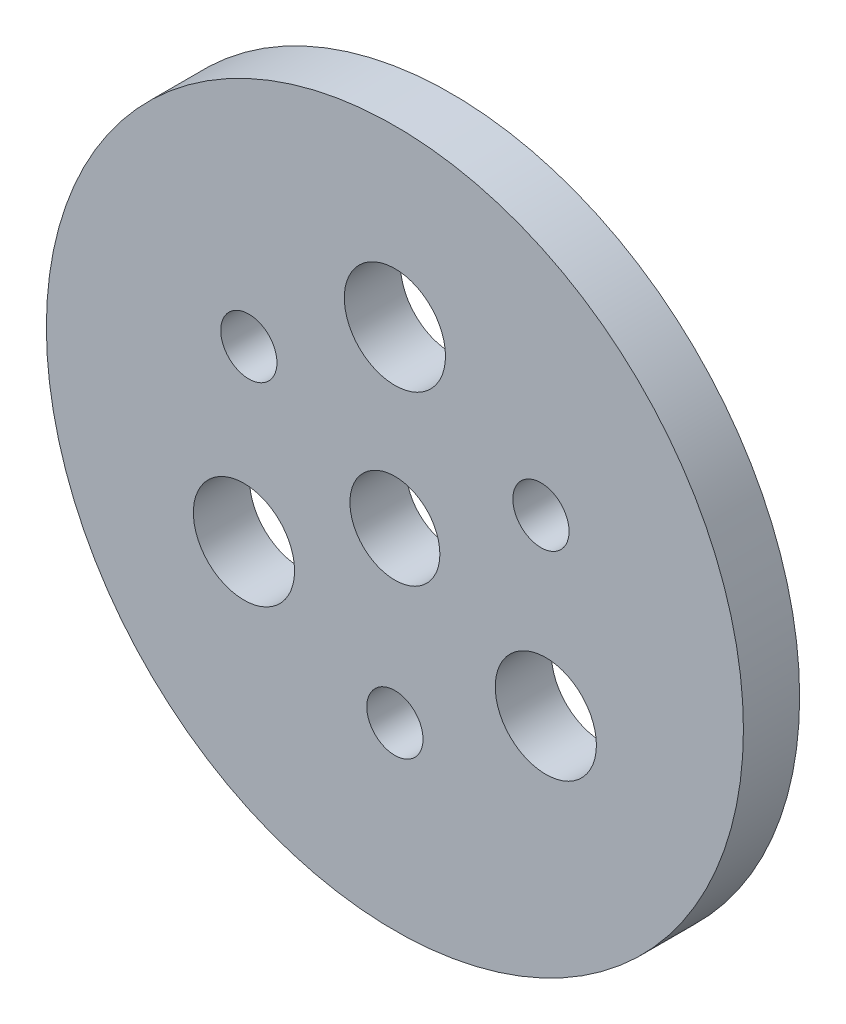
ISO-10303-21;
HEADER;
FILE_DESCRIPTION(('STEP AP214'),'2;1');
FILE_NAME('part.step','',(''),(''),'','','');
FILE_SCHEMA(('AUTOMOTIVE_DESIGN { 1 0 10303 214 1 1 1 1 }'));
ENDSEC;
DATA;
#1=APPLICATION_CONTEXT('core data for automotive mechanical design processes');
#2=APPLICATION_PROTOCOL_DEFINITION('international standard','automotive_design',2000,#1);
#3=PRODUCT_CONTEXT('',#1,'mechanical');
#4=PRODUCT('Part','Part','',(#3));
#5=PRODUCT_RELATED_PRODUCT_CATEGORY('part','',(#4));
#6=PRODUCT_DEFINITION_FORMATION('','',#4);
#7=PRODUCT_DEFINITION_CONTEXT('part definition',#1,'design');
#8=PRODUCT_DEFINITION('design','',#6,#7);
#9=PRODUCT_DEFINITION_SHAPE('','',#8);
#10=(LENGTH_UNIT() NAMED_UNIT(*) SI_UNIT(.MILLI.,.METRE.));
#11=(NAMED_UNIT(*) PLANE_ANGLE_UNIT() SI_UNIT($,.RADIAN.));
#12=(NAMED_UNIT(*) SI_UNIT($,.STERADIAN.) SOLID_ANGLE_UNIT());
#13=UNCERTAINTY_MEASURE_WITH_UNIT(LENGTH_MEASURE(1.E-05),#10,'distance_accuracy_value','');
#14=(GEOMETRIC_REPRESENTATION_CONTEXT(3) GLOBAL_UNCERTAINTY_ASSIGNED_CONTEXT((#13)) GLOBAL_UNIT_ASSIGNED_CONTEXT((#10,
#11,#12)) REPRESENTATION_CONTEXT('',''));
#15=CARTESIAN_POINT('',(0.,0.,0.));
#16=DIRECTION('',(0.,0.,1.));
#17=DIRECTION('',(1.,0.,0.));
#18=AXIS2_PLACEMENT_3D('',#15,#16,#17);
#19=CARTESIAN_POINT('',(0.,0.,5.));
#20=DIRECTION('',(0.,0.,1.));
#21=DIRECTION('',(1.,0.,0.));
#22=AXIS2_PLACEMENT_3D('',#19,#20,#21);
#23=PLANE('',#22);
#24=CARTESIAN_POINT('',(13.4233937586598,-7.74999999999943,5.));
#25=DIRECTION('',(0.,0.,1.));
#26=DIRECTION('',(1.,0.,0.));
#27=AXIS2_PLACEMENT_3D('',#24,#25,#26);
#28=CIRCLE('',#27,4.5);
#29=CARTESIAN_POINT('',(17.9233937586598,-7.74999999999943,5.));
#30=VERTEX_POINT('',#29);
#31=EDGE_CURVE('E71',#30,#30,#28,.T.);
#32=ORIENTED_EDGE('',*,*,#31,.F.);
#33=EDGE_LOOP('',(#32));
#34=FACE_BOUND('',#33,.T.);
#35=CARTESIAN_POINT('',(0.,15.5,5.));
#36=DIRECTION('',(0.,0.,1.));
#37=DIRECTION('',(1.,0.,0.));
#38=AXIS2_PLACEMENT_3D('',#35,#36,#37);
#39=CIRCLE('',#38,4.5);
#40=CARTESIAN_POINT('',(4.5,15.5,5.));
#41=VERTEX_POINT('',#40);
#42=EDGE_CURVE('E59',#41,#41,#39,.T.);
#43=ORIENTED_EDGE('',*,*,#42,.F.);
#44=EDGE_LOOP('',(#43));
#45=FACE_BOUND('',#44,.T.);
#46=CARTESIAN_POINT('',(0.,-15.,5.));
#47=DIRECTION('',(0.,0.,1.));
#48=DIRECTION('',(1.,0.,0.));
#49=AXIS2_PLACEMENT_3D('',#46,#47,#48);
#50=CIRCLE('',#49,2.5);
#51=CARTESIAN_POINT('',(2.5,-15.,5.));
#52=VERTEX_POINT('',#51);
#53=EDGE_CURVE('E47',#52,#52,#50,.T.);
#54=ORIENTED_EDGE('',*,*,#53,.F.);
#55=EDGE_LOOP('',(#54));
#56=FACE_BOUND('',#55,.T.);
#57=CARTESIAN_POINT('',(0.,0.,5.));
#58=DIRECTION('',(0.,0.,1.));
#59=DIRECTION('',(1.,0.,0.));
#60=AXIS2_PLACEMENT_3D('',#57,#58,#59);
#61=CIRCLE('',#60,31.);
#62=CARTESIAN_POINT('',(31.,0.,5.));
#63=VERTEX_POINT('',#62);
#64=EDGE_CURVE('E10',#63,#63,#61,.T.);
#65=ORIENTED_EDGE('',*,*,#64,.T.);
#66=EDGE_LOOP('',(#65));
#67=FACE_BOUND('',#66,.T.);
#68=CARTESIAN_POINT('',(0.,0.,5.));
#69=DIRECTION('',(0.,0.,1.));
#70=DIRECTION('',(1.,0.,0.));
#71=AXIS2_PLACEMENT_3D('',#68,#69,#70);
#72=CIRCLE('',#71,4.);
#73=CARTESIAN_POINT('',(4.,0.,5.));
#74=VERTEX_POINT('',#73);
#75=EDGE_CURVE('E42',#74,#74,#72,.T.);
#76=ORIENTED_EDGE('',*,*,#75,.F.);
#77=EDGE_LOOP('',(#76));
#78=FACE_BOUND('',#77,.T.);
#79=CARTESIAN_POINT('',(-12.9903810567666,7.50000000000006,5.));
#80=DIRECTION('',(0.,0.,1.));
#81=DIRECTION('',(1.,0.,0.));
#82=AXIS2_PLACEMENT_3D('',#79,#80,#81);
#83=CIRCLE('',#82,2.5);
#84=CARTESIAN_POINT('',(-10.4903810567666,7.50000000000006,5.));
#85=VERTEX_POINT('',#84);
#86=EDGE_CURVE('E53',#85,#85,#83,.T.);
#87=ORIENTED_EDGE('',*,*,#86,.F.);
#88=EDGE_LOOP('',(#87));
#89=FACE_BOUND('',#88,.T.);
#90=CARTESIAN_POINT('',(12.9903810567667,7.49999999999988,5.));
#91=DIRECTION('',(0.,0.,1.));
#92=DIRECTION('',(1.,0.,0.));
#93=AXIS2_PLACEMENT_3D('',#90,#91,#92);
#94=CIRCLE('',#93,2.5);
#95=CARTESIAN_POINT('',(15.4903810567667,7.49999999999988,5.));
#96=VERTEX_POINT('',#95);
#97=EDGE_CURVE('E65',#96,#96,#94,.T.);
#98=ORIENTED_EDGE('',*,*,#97,.F.);
#99=EDGE_LOOP('',(#98));
#100=FACE_BOUND('',#99,.T.);
#101=CARTESIAN_POINT('',(-13.4233937586578,-7.75000000000058,5.));
#102=DIRECTION('',(0.,0.,1.));
#103=DIRECTION('',(1.,0.,0.));
#104=AXIS2_PLACEMENT_3D('',#101,#102,#103);
#105=CIRCLE('',#104,4.5);
#106=CARTESIAN_POINT('',(-8.92339375865781,-7.75000000000058,5.));
#107=VERTEX_POINT('',#106);
#108=EDGE_CURVE('E77',#107,#107,#105,.T.);
#109=ORIENTED_EDGE('',*,*,#108,.F.);
#110=EDGE_LOOP('',(#109));
#111=FACE_BOUND('',#110,.T.);
#112=ADVANCED_FACE('F31',(#34,#45,#56,#67,#78,#89,#100,#111),#23,.T.);
#113=CARTESIAN_POINT('',(0.,0.,0.));
#114=DIRECTION('',(0.,0.,1.));
#115=DIRECTION('',(1.,0.,0.));
#116=AXIS2_PLACEMENT_3D('',#113,#114,#115);
#117=PLANE('',#116);
#118=CARTESIAN_POINT('',(0.,0.,0.));
#119=DIRECTION('',(0.,0.,1.));
#120=DIRECTION('',(1.,0.,0.));
#121=AXIS2_PLACEMENT_3D('',#118,#119,#120);
#122=CIRCLE('',#121,31.);
#123=CARTESIAN_POINT('',(31.,0.,0.));
#124=VERTEX_POINT('',#123);
#125=EDGE_CURVE('E35',#124,#124,#122,.T.);
#126=ORIENTED_EDGE('',*,*,#125,.F.);
#127=EDGE_LOOP('',(#126));
#128=FACE_BOUND('',#127,.T.);
#129=CARTESIAN_POINT('',(0.,0.,0.));
#130=DIRECTION('',(0.,0.,1.));
#131=DIRECTION('',(1.,0.,0.));
#132=AXIS2_PLACEMENT_3D('',#129,#130,#131);
#133=CIRCLE('',#132,4.);
#134=CARTESIAN_POINT('',(4.,0.,0.));
#135=VERTEX_POINT('',#134);
#136=EDGE_CURVE('E44',#135,#135,#133,.T.);
#137=ORIENTED_EDGE('',*,*,#136,.T.);
#138=EDGE_LOOP('',(#137));
#139=FACE_BOUND('',#138,.T.);
#140=CARTESIAN_POINT('',(0.,-15.,0.));
#141=DIRECTION('',(0.,0.,1.));
#142=DIRECTION('',(1.,0.,0.));
#143=AXIS2_PLACEMENT_3D('',#140,#141,#142);
#144=CIRCLE('',#143,2.5);
#145=CARTESIAN_POINT('',(2.5,-15.,0.));
#146=VERTEX_POINT('',#145);
#147=EDGE_CURVE('E50',#146,#146,#144,.T.);
#148=ORIENTED_EDGE('',*,*,#147,.T.);
#149=EDGE_LOOP('',(#148));
#150=FACE_BOUND('',#149,.T.);
#151=CARTESIAN_POINT('',(-12.9903810567666,7.50000000000006,0.));
#152=DIRECTION('',(0.,0.,1.));
#153=DIRECTION('',(1.,0.,0.));
#154=AXIS2_PLACEMENT_3D('',#151,#152,#153);
#155=CIRCLE('',#154,2.5);
#156=CARTESIAN_POINT('',(-10.4903810567666,7.50000000000006,0.));
#157=VERTEX_POINT('',#156);
#158=EDGE_CURVE('E56',#157,#157,#155,.T.);
#159=ORIENTED_EDGE('',*,*,#158,.T.);
#160=EDGE_LOOP('',(#159));
#161=FACE_BOUND('',#160,.T.);
#162=CARTESIAN_POINT('',(0.,15.5,0.));
#163=DIRECTION('',(0.,0.,1.));
#164=DIRECTION('',(1.,0.,0.));
#165=AXIS2_PLACEMENT_3D('',#162,#163,#164);
#166=CIRCLE('',#165,4.5);
#167=CARTESIAN_POINT('',(4.5,15.5,0.));
#168=VERTEX_POINT('',#167);
#169=EDGE_CURVE('E62',#168,#168,#166,.T.);
#170=ORIENTED_EDGE('',*,*,#169,.T.);
#171=EDGE_LOOP('',(#170));
#172=FACE_BOUND('',#171,.T.);
#173=CARTESIAN_POINT('',(12.9903810567667,7.49999999999988,0.));
#174=DIRECTION('',(0.,0.,1.));
#175=DIRECTION('',(1.,0.,0.));
#176=AXIS2_PLACEMENT_3D('',#173,#174,#175);
#177=CIRCLE('',#176,2.5);
#178=CARTESIAN_POINT('',(15.4903810567667,7.49999999999988,0.));
#179=VERTEX_POINT('',#178);
#180=EDGE_CURVE('E68',#179,#179,#177,.T.);
#181=ORIENTED_EDGE('',*,*,#180,.T.);
#182=EDGE_LOOP('',(#181));
#183=FACE_BOUND('',#182,.T.);
#184=CARTESIAN_POINT('',(13.4233937586598,-7.74999999999943,0.));
#185=DIRECTION('',(0.,0.,1.));
#186=DIRECTION('',(1.,0.,0.));
#187=AXIS2_PLACEMENT_3D('',#184,#185,#186);
#188=CIRCLE('',#187,4.5);
#189=CARTESIAN_POINT('',(17.9233937586598,-7.74999999999943,0.));
#190=VERTEX_POINT('',#189);
#191=EDGE_CURVE('E74',#190,#190,#188,.T.);
#192=ORIENTED_EDGE('',*,*,#191,.T.);
#193=EDGE_LOOP('',(#192));
#194=FACE_BOUND('',#193,.T.);
#195=CARTESIAN_POINT('',(-13.4233937586578,-7.75000000000058,0.));
#196=DIRECTION('',(0.,0.,1.));
#197=DIRECTION('',(1.,0.,0.));
#198=AXIS2_PLACEMENT_3D('',#195,#196,#197);
#199=CIRCLE('',#198,4.5);
#200=CARTESIAN_POINT('',(-8.92339375865781,-7.75000000000058,0.));
#201=VERTEX_POINT('',#200);
#202=EDGE_CURVE('E80',#201,#201,#199,.T.);
#203=ORIENTED_EDGE('',*,*,#202,.T.);
#204=EDGE_LOOP('',(#203));
#205=FACE_BOUND('',#204,.T.);
#206=ADVANCED_FACE('F90',(#128,#139,#150,#161,#172,#183,#194,#205),#117,.F.);
#207=CARTESIAN_POINT('',(0.,0.,5.));
#208=DIRECTION('',(0.,0.,-1.));
#209=DIRECTION('',(-1.,0.,0.));
#210=AXIS2_PLACEMENT_3D('',#207,#208,#209);
#211=CYLINDRICAL_SURFACE('',#210,31.);
#212=ORIENTED_EDGE('',*,*,#64,.F.);
#213=EDGE_LOOP('',(#212));
#214=FACE_BOUND('',#213,.T.);
#215=ORIENTED_EDGE('',*,*,#125,.T.);
#216=EDGE_LOOP('',(#215));
#217=FACE_BOUND('',#216,.T.);
#218=ADVANCED_FACE('F33',(#214,#217),#211,.T.);
#219=CARTESIAN_POINT('',(0.,0.,5.));
#220=DIRECTION('',(0.,0.,-1.));
#221=DIRECTION('',(-1.,0.,0.));
#222=AXIS2_PLACEMENT_3D('',#219,#220,#221);
#223=CYLINDRICAL_SURFACE('',#222,4.);
#224=ORIENTED_EDGE('',*,*,#75,.T.);
#225=EDGE_LOOP('',(#224));
#226=FACE_BOUND('',#225,.T.);
#227=ORIENTED_EDGE('',*,*,#136,.F.);
#228=EDGE_LOOP('',(#227));
#229=FACE_BOUND('',#228,.T.);
#230=ADVANCED_FACE('F100',(#226,#229),#223,.F.);
#231=CARTESIAN_POINT('',(0.,-15.,5.));
#232=DIRECTION('',(0.,0.,-1.));
#233=DIRECTION('',(-1.,0.,0.));
#234=AXIS2_PLACEMENT_3D('',#231,#232,#233);
#235=CYLINDRICAL_SURFACE('',#234,2.5);
#236=ORIENTED_EDGE('',*,*,#53,.T.);
#237=EDGE_LOOP('',(#236));
#238=FACE_BOUND('',#237,.T.);
#239=ORIENTED_EDGE('',*,*,#147,.F.);
#240=EDGE_LOOP('',(#239));
#241=FACE_BOUND('',#240,.T.);
#242=ADVANCED_FACE('F103',(#238,#241),#235,.F.);
#243=CARTESIAN_POINT('',(-12.9903810567666,7.50000000000006,5.));
#244=DIRECTION('',(0.,0.,-1.));
#245=DIRECTION('',(-1.,0.,0.));
#246=AXIS2_PLACEMENT_3D('',#243,#244,#245);
#247=CYLINDRICAL_SURFACE('',#246,2.5);
#248=ORIENTED_EDGE('',*,*,#86,.T.);
#249=EDGE_LOOP('',(#248));
#250=FACE_BOUND('',#249,.T.);
#251=ORIENTED_EDGE('',*,*,#158,.F.);
#252=EDGE_LOOP('',(#251));
#253=FACE_BOUND('',#252,.T.);
#254=ADVANCED_FACE('F107',(#250,#253),#247,.F.);
#255=CARTESIAN_POINT('',(0.,15.5,5.));
#256=DIRECTION('',(0.,0.,-1.));
#257=DIRECTION('',(-1.,0.,0.));
#258=AXIS2_PLACEMENT_3D('',#255,#256,#257);
#259=CYLINDRICAL_SURFACE('',#258,4.5);
#260=ORIENTED_EDGE('',*,*,#42,.T.);
#261=EDGE_LOOP('',(#260));
#262=FACE_BOUND('',#261,.T.);
#263=ORIENTED_EDGE('',*,*,#169,.F.);
#264=EDGE_LOOP('',(#263));
#265=FACE_BOUND('',#264,.T.);
#266=ADVANCED_FACE('F111',(#262,#265),#259,.F.);
#267=CARTESIAN_POINT('',(12.9903810567667,7.49999999999988,5.));
#268=DIRECTION('',(0.,0.,-1.));
#269=DIRECTION('',(-1.,0.,0.));
#270=AXIS2_PLACEMENT_3D('',#267,#268,#269);
#271=CYLINDRICAL_SURFACE('',#270,2.5);
#272=ORIENTED_EDGE('',*,*,#97,.T.);
#273=EDGE_LOOP('',(#272));
#274=FACE_BOUND('',#273,.T.);
#275=ORIENTED_EDGE('',*,*,#180,.F.);
#276=EDGE_LOOP('',(#275));
#277=FACE_BOUND('',#276,.T.);
#278=ADVANCED_FACE('F115',(#274,#277),#271,.F.);
#279=CARTESIAN_POINT('',(13.4233937586598,-7.74999999999943,5.));
#280=DIRECTION('',(0.,0.,-1.));
#281=DIRECTION('',(-1.,0.,0.));
#282=AXIS2_PLACEMENT_3D('',#279,#280,#281);
#283=CYLINDRICAL_SURFACE('',#282,4.5);
#284=ORIENTED_EDGE('',*,*,#31,.T.);
#285=EDGE_LOOP('',(#284));
#286=FACE_BOUND('',#285,.T.);
#287=ORIENTED_EDGE('',*,*,#191,.F.);
#288=EDGE_LOOP('',(#287));
#289=FACE_BOUND('',#288,.T.);
#290=ADVANCED_FACE('F119',(#286,#289),#283,.F.);
#291=CARTESIAN_POINT('',(-13.4233937586578,-7.75000000000058,5.));
#292=DIRECTION('',(0.,0.,-1.));
#293=DIRECTION('',(-1.,0.,0.));
#294=AXIS2_PLACEMENT_3D('',#291,#292,#293);
#295=CYLINDRICAL_SURFACE('',#294,4.5);
#296=ORIENTED_EDGE('',*,*,#108,.T.);
#297=EDGE_LOOP('',(#296));
#298=FACE_BOUND('',#297,.T.);
#299=ORIENTED_EDGE('',*,*,#202,.F.);
#300=EDGE_LOOP('',(#299));
#301=FACE_BOUND('',#300,.T.);
#302=ADVANCED_FACE('F86',(#298,#301),#295,.F.);
#303=CLOSED_SHELL('',(#112,#206,#218,#230,#242,#254,#266,#278,#290,#302));
#304=MANIFOLD_SOLID_BREP('B2',#303);
#305=ADVANCED_BREP_SHAPE_REPRESENTATION('',(#18,#304),#14);
#306=SHAPE_DEFINITION_REPRESENTATION(#9,#305);
ENDSEC;
END-ISO-10303-21;
